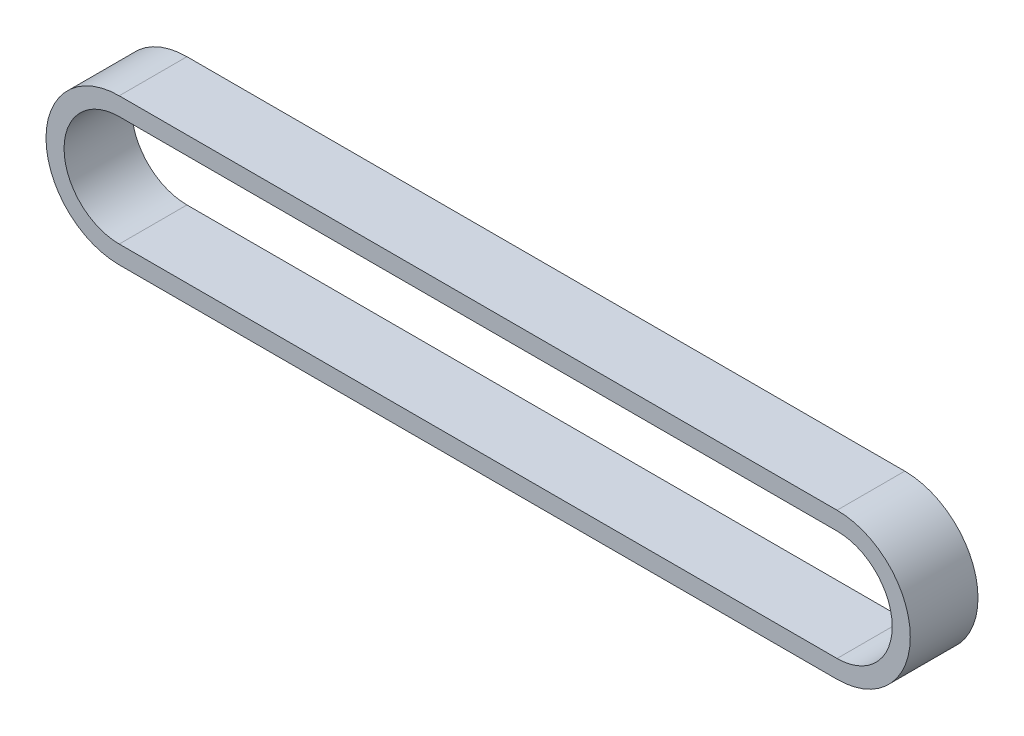
ISO-10303-21;
HEADER;
FILE_DESCRIPTION(('STEP AP214'),'2;1');
FILE_NAME('part.step','',(''),(''),'','','');
FILE_SCHEMA(('AUTOMOTIVE_DESIGN { 1 0 10303 214 1 1 1 1 }'));
ENDSEC;
DATA;
#1=APPLICATION_CONTEXT('core data for automotive mechanical design processes');
#2=APPLICATION_PROTOCOL_DEFINITION('international standard','automotive_design',2000,#1);
#3=PRODUCT_CONTEXT('',#1,'mechanical');
#4=PRODUCT('Part','Part','',(#3));
#5=PRODUCT_RELATED_PRODUCT_CATEGORY('part','',(#4));
#6=PRODUCT_DEFINITION_FORMATION('','',#4);
#7=PRODUCT_DEFINITION_CONTEXT('part definition',#1,'design');
#8=PRODUCT_DEFINITION('design','',#6,#7);
#9=PRODUCT_DEFINITION_SHAPE('','',#8);
#10=(LENGTH_UNIT() NAMED_UNIT(*) SI_UNIT(.MILLI.,.METRE.));
#11=(NAMED_UNIT(*) PLANE_ANGLE_UNIT() SI_UNIT($,.RADIAN.));
#12=(NAMED_UNIT(*) SI_UNIT($,.STERADIAN.) SOLID_ANGLE_UNIT());
#13=UNCERTAINTY_MEASURE_WITH_UNIT(LENGTH_MEASURE(1.E-05),#10,'distance_accuracy_value','');
#14=(GEOMETRIC_REPRESENTATION_CONTEXT(3) GLOBAL_UNCERTAINTY_ASSIGNED_CONTEXT((#13)) GLOBAL_UNIT_ASSIGNED_CONTEXT((#10,
#11,#12)) REPRESENTATION_CONTEXT('',''));
#15=CARTESIAN_POINT('',(0.,0.,0.));
#16=DIRECTION('',(0.,0.,1.));
#17=DIRECTION('',(1.,0.,0.));
#18=AXIS2_PLACEMENT_3D('',#15,#16,#17);
#19=CARTESIAN_POINT('',(-39.75,0.,7.5));
#20=DIRECTION('',(0.,0.,1.));
#21=DIRECTION('',(1.,0.,0.));
#22=AXIS2_PLACEMENT_3D('',#19,#20,#21);
#23=PLANE('',#22);
#24=CARTESIAN_POINT('',(-39.75,0.,7.5));
#25=DIRECTION('',(0.,0.,1.));
#26=DIRECTION('',(1.,0.,0.));
#27=AXIS2_PLACEMENT_3D('',#24,#25,#26);
#28=CIRCLE('',#27,8.11);
#29=CARTESIAN_POINT('',(-39.75,8.11,7.5));
#30=VERTEX_POINT('',#29);
#31=CARTESIAN_POINT('',(-39.75,-8.11,7.5));
#32=VERTEX_POINT('',#31);
#33=EDGE_CURVE('E153',#30,#32,#28,.T.);
#34=ORIENTED_EDGE('',*,*,#33,.T.);
#35=DIRECTION('',(1.,0.,0.));
#36=VECTOR('',#35,1.);
#37=CARTESIAN_POINT('',(-39.75,-8.11,7.5));
#38=LINE('',#37,#36);
#39=CARTESIAN_POINT('',(39.75,-8.10999999999999,7.5));
#40=VERTEX_POINT('',#39);
#41=EDGE_CURVE('E157',#32,#40,#38,.T.);
#42=ORIENTED_EDGE('',*,*,#41,.T.);
#43=CARTESIAN_POINT('',(39.75,0.,7.5));
#44=DIRECTION('',(0.,0.,1.));
#45=DIRECTION('',(-1.,0.,0.));
#46=AXIS2_PLACEMENT_3D('',#43,#44,#45);
#47=CIRCLE('',#46,8.11);
#48=CARTESIAN_POINT('',(39.75,8.11000000000001,7.5));
#49=VERTEX_POINT('',#48);
#50=EDGE_CURVE('E161',#40,#49,#47,.T.);
#51=ORIENTED_EDGE('',*,*,#50,.T.);
#52=DIRECTION('',(-1.,0.,0.));
#53=VECTOR('',#52,1.);
#54=CARTESIAN_POINT('',(-39.75,8.11,7.5));
#55=LINE('',#54,#53);
#56=EDGE_CURVE('E164',#49,#30,#55,.T.);
#57=ORIENTED_EDGE('',*,*,#56,.T.);
#58=EDGE_LOOP('',(#34,#42,#51,#57));
#59=FACE_BOUND('',#58,.T.);
#60=DIRECTION('',(1.,0.,0.));
#61=VECTOR('',#60,1.);
#62=CARTESIAN_POINT('',(-39.75,-6.11,7.5));
#63=LINE('',#62,#61);
#64=CARTESIAN_POINT('',(-39.75,-6.11,7.5));
#65=VERTEX_POINT('',#64);
#66=CARTESIAN_POINT('',(39.75,-6.10999999999999,7.5));
#67=VERTEX_POINT('',#66);
#68=EDGE_CURVE('E114',#65,#67,#63,.T.);
#69=ORIENTED_EDGE('',*,*,#68,.F.);
#70=CARTESIAN_POINT('',(-39.75,0.,7.5));
#71=DIRECTION('',(0.,0.,1.));
#72=DIRECTION('',(1.,0.,0.));
#73=AXIS2_PLACEMENT_3D('',#70,#71,#72);
#74=CIRCLE('',#73,6.11);
#75=CARTESIAN_POINT('',(-39.75,6.11,7.5));
#76=VERTEX_POINT('',#75);
#77=EDGE_CURVE('E105',#76,#65,#74,.T.);
#78=ORIENTED_EDGE('',*,*,#77,.F.);
#79=DIRECTION('',(-1.,0.,0.));
#80=VECTOR('',#79,1.);
#81=CARTESIAN_POINT('',(-39.75,6.11,7.5));
#82=LINE('',#81,#80);
#83=CARTESIAN_POINT('',(39.75,6.11000000000001,7.5));
#84=VERTEX_POINT('',#83);
#85=EDGE_CURVE('E131',#84,#76,#82,.T.);
#86=ORIENTED_EDGE('',*,*,#85,.F.);
#87=CARTESIAN_POINT('',(39.75,0.,7.5));
#88=DIRECTION('',(0.,0.,1.));
#89=DIRECTION('',(-1.,0.,0.));
#90=AXIS2_PLACEMENT_3D('',#87,#88,#89);
#91=CIRCLE('',#90,6.11);
#92=EDGE_CURVE('E127',#67,#84,#91,.T.);
#93=ORIENTED_EDGE('',*,*,#92,.F.);
#94=EDGE_LOOP('',(#69,#78,#86,#93));
#95=FACE_BOUND('',#94,.T.);
#96=ADVANCED_FACE('F39',(#59,#95),#23,.T.);
#97=CARTESIAN_POINT('',(-39.75,0.,0.));
#98=DIRECTION('',(0.,0.,1.));
#99=DIRECTION('',(1.,0.,0.));
#100=AXIS2_PLACEMENT_3D('',#97,#98,#99);
#101=PLANE('',#100);
#102=CARTESIAN_POINT('',(-39.75,0.,0.));
#103=DIRECTION('',(0.,0.,1.));
#104=DIRECTION('',(1.,0.,0.));
#105=AXIS2_PLACEMENT_3D('',#102,#103,#104);
#106=CIRCLE('',#105,8.11);
#107=CARTESIAN_POINT('',(-39.75,8.11,0.));
#108=VERTEX_POINT('',#107);
#109=CARTESIAN_POINT('',(-39.75,-8.11,0.));
#110=VERTEX_POINT('',#109);
#111=EDGE_CURVE('E123',#108,#110,#106,.T.);
#112=ORIENTED_EDGE('',*,*,#111,.F.);
#113=DIRECTION('',(-1.,0.,0.));
#114=VECTOR('',#113,1.);
#115=CARTESIAN_POINT('',(-39.75,8.11,0.));
#116=LINE('',#115,#114);
#117=CARTESIAN_POINT('',(39.75,8.11000000000001,0.));
#118=VERTEX_POINT('',#117);
#119=EDGE_CURVE('E158',#118,#108,#116,.T.);
#120=ORIENTED_EDGE('',*,*,#119,.F.);
#121=CARTESIAN_POINT('',(39.75,0.,0.));
#122=DIRECTION('',(0.,0.,1.));
#123=DIRECTION('',(-1.,0.,0.));
#124=AXIS2_PLACEMENT_3D('',#121,#122,#123);
#125=CIRCLE('',#124,8.11);
#126=CARTESIAN_POINT('',(39.75,-8.10999999999999,0.));
#127=VERTEX_POINT('',#126);
#128=EDGE_CURVE('E174',#127,#118,#125,.T.);
#129=ORIENTED_EDGE('',*,*,#128,.F.);
#130=DIRECTION('',(1.,0.,0.));
#131=VECTOR('',#130,1.);
#132=CARTESIAN_POINT('',(-39.75,-8.11,0.));
#133=LINE('',#132,#131);
#134=EDGE_CURVE('E171',#110,#127,#133,.T.);
#135=ORIENTED_EDGE('',*,*,#134,.F.);
#136=EDGE_LOOP('',(#112,#120,#129,#135));
#137=FACE_BOUND('',#136,.T.);
#138=CARTESIAN_POINT('',(-39.75,0.,0.));
#139=DIRECTION('',(0.,0.,1.));
#140=DIRECTION('',(1.,0.,0.));
#141=AXIS2_PLACEMENT_3D('',#138,#139,#140);
#142=CIRCLE('',#141,6.11);
#143=CARTESIAN_POINT('',(-39.75,6.11,0.));
#144=VERTEX_POINT('',#143);
#145=CARTESIAN_POINT('',(-39.75,-6.11,0.));
#146=VERTEX_POINT('',#145);
#147=EDGE_CURVE('E63',#144,#146,#142,.T.);
#148=ORIENTED_EDGE('',*,*,#147,.T.);
#149=DIRECTION('',(1.,0.,0.));
#150=VECTOR('',#149,1.);
#151=CARTESIAN_POINT('',(-39.75,-6.11,0.));
#152=LINE('',#151,#150);
#153=CARTESIAN_POINT('',(39.75,-6.10999999999999,0.));
#154=VERTEX_POINT('',#153);
#155=EDGE_CURVE('E121',#146,#154,#152,.T.);
#156=ORIENTED_EDGE('',*,*,#155,.T.);
#157=CARTESIAN_POINT('',(39.75,0.,0.));
#158=DIRECTION('',(0.,0.,1.));
#159=DIRECTION('',(-1.,0.,0.));
#160=AXIS2_PLACEMENT_3D('',#157,#158,#159);
#161=CIRCLE('',#160,6.11);
#162=CARTESIAN_POINT('',(39.75,6.11000000000001,0.));
#163=VERTEX_POINT('',#162);
#164=EDGE_CURVE('E140',#154,#163,#161,.T.);
#165=ORIENTED_EDGE('',*,*,#164,.T.);
#166=DIRECTION('',(-1.,0.,0.));
#167=VECTOR('',#166,1.);
#168=CARTESIAN_POINT('',(-39.75,6.11,0.));
#169=LINE('',#168,#167);
#170=EDGE_CURVE('E115',#163,#144,#169,.T.);
#171=ORIENTED_EDGE('',*,*,#170,.T.);
#172=EDGE_LOOP('',(#148,#156,#165,#171));
#173=FACE_BOUND('',#172,.T.);
#174=ADVANCED_FACE('F197',(#137,#173),#101,.F.);
#175=CARTESIAN_POINT('',(-39.75,0.,7.5));
#176=DIRECTION('',(0.,0.,-1.));
#177=DIRECTION('',(-1.,0.,0.));
#178=AXIS2_PLACEMENT_3D('',#175,#176,#177);
#179=CYLINDRICAL_SURFACE('',#178,8.11);
#180=ORIENTED_EDGE('',*,*,#111,.T.);
#181=DIRECTION('',(0.,0.,-1.));
#182=VECTOR('',#181,1.);
#183=CARTESIAN_POINT('',(-39.75,-8.11,7.5));
#184=LINE('',#183,#182);
#185=EDGE_CURVE('E11',#32,#110,#184,.T.);
#186=ORIENTED_EDGE('',*,*,#185,.F.);
#187=ORIENTED_EDGE('',*,*,#33,.F.);
#188=DIRECTION('',(0.,0.,-1.));
#189=VECTOR('',#188,1.);
#190=CARTESIAN_POINT('',(-39.75,8.11,7.5));
#191=LINE('',#190,#189);
#192=EDGE_CURVE('E167',#30,#108,#191,.T.);
#193=ORIENTED_EDGE('',*,*,#192,.T.);
#194=EDGE_LOOP('',(#180,#186,#187,#193));
#195=FACE_BOUND('',#194,.T.);
#196=ADVANCED_FACE('F41',(#195),#179,.T.);
#197=CARTESIAN_POINT('',(-39.75,-8.11,7.5));
#198=DIRECTION('',(0.,1.,0.));
#199=DIRECTION('',(-1.,0.,0.));
#200=AXIS2_PLACEMENT_3D('',#197,#198,#199);
#201=PLANE('',#200);
#202=ORIENTED_EDGE('',*,*,#134,.T.);
#203=DIRECTION('',(0.,0.,-1.));
#204=VECTOR('',#203,1.);
#205=CARTESIAN_POINT('',(39.75,-8.10999999999999,7.5));
#206=LINE('',#205,#204);
#207=EDGE_CURVE('E48',#40,#127,#206,.T.);
#208=ORIENTED_EDGE('',*,*,#207,.F.);
#209=ORIENTED_EDGE('',*,*,#41,.F.);
#210=ORIENTED_EDGE('',*,*,#185,.T.);
#211=EDGE_LOOP('',(#202,#208,#209,#210));
#212=FACE_BOUND('',#211,.T.);
#213=ADVANCED_FACE('F207',(#212),#201,.F.);
#214=CARTESIAN_POINT('',(39.75,0.,7.5));
#215=DIRECTION('',(0.,0.,-1.));
#216=DIRECTION('',(-1.,0.,0.));
#217=AXIS2_PLACEMENT_3D('',#214,#215,#216);
#218=CYLINDRICAL_SURFACE('',#217,8.11);
#219=ORIENTED_EDGE('',*,*,#128,.T.);
#220=DIRECTION('',(0.,0.,-1.));
#221=VECTOR('',#220,1.);
#222=CARTESIAN_POINT('',(39.75,8.11000000000001,7.5));
#223=LINE('',#222,#221);
#224=EDGE_CURVE('E182',#49,#118,#223,.T.);
#225=ORIENTED_EDGE('',*,*,#224,.F.);
#226=ORIENTED_EDGE('',*,*,#50,.F.);
#227=ORIENTED_EDGE('',*,*,#207,.T.);
#228=EDGE_LOOP('',(#219,#225,#226,#227));
#229=FACE_BOUND('',#228,.T.);
#230=ADVANCED_FACE('F191',(#229),#218,.T.);
#231=CARTESIAN_POINT('',(-39.75,8.11,7.5));
#232=DIRECTION('',(0.,-1.,0.));
#233=DIRECTION('',(1.,0.,0.));
#234=AXIS2_PLACEMENT_3D('',#231,#232,#233);
#235=PLANE('',#234);
#236=ORIENTED_EDGE('',*,*,#119,.T.);
#237=ORIENTED_EDGE('',*,*,#192,.F.);
#238=ORIENTED_EDGE('',*,*,#56,.F.);
#239=ORIENTED_EDGE('',*,*,#224,.T.);
#240=EDGE_LOOP('',(#236,#237,#238,#239));
#241=FACE_BOUND('',#240,.T.);
#242=ADVANCED_FACE('F201',(#241),#235,.F.);
#243=CARTESIAN_POINT('',(-39.75,0.,7.5));
#244=DIRECTION('',(0.,0.,-1.));
#245=DIRECTION('',(-1.,0.,0.));
#246=AXIS2_PLACEMENT_3D('',#243,#244,#245);
#247=CYLINDRICAL_SURFACE('',#246,6.11);
#248=ORIENTED_EDGE('',*,*,#147,.F.);
#249=DIRECTION('',(0.,0.,-1.));
#250=VECTOR('',#249,1.);
#251=CARTESIAN_POINT('',(-39.75,6.11,7.5));
#252=LINE('',#251,#250);
#253=EDGE_CURVE('E109',#76,#144,#252,.T.);
#254=ORIENTED_EDGE('',*,*,#253,.F.);
#255=ORIENTED_EDGE('',*,*,#77,.T.);
#256=DIRECTION('',(0.,0.,-1.));
#257=VECTOR('',#256,1.);
#258=CARTESIAN_POINT('',(-39.75,-6.11,7.5));
#259=LINE('',#258,#257);
#260=EDGE_CURVE('E108',#65,#146,#259,.T.);
#261=ORIENTED_EDGE('',*,*,#260,.T.);
#262=EDGE_LOOP('',(#248,#254,#255,#261));
#263=FACE_BOUND('',#262,.T.);
#264=ADVANCED_FACE('F107',(#263),#247,.F.);
#265=CARTESIAN_POINT('',(-39.75,-6.11,7.5));
#266=DIRECTION('',(0.,1.,0.));
#267=DIRECTION('',(-1.,0.,0.));
#268=AXIS2_PLACEMENT_3D('',#265,#266,#267);
#269=PLANE('',#268);
#270=ORIENTED_EDGE('',*,*,#155,.F.);
#271=ORIENTED_EDGE('',*,*,#260,.F.);
#272=ORIENTED_EDGE('',*,*,#68,.T.);
#273=DIRECTION('',(0.,0.,-1.));
#274=VECTOR('',#273,1.);
#275=CARTESIAN_POINT('',(39.75,-6.10999999999999,7.5));
#276=LINE('',#275,#274);
#277=EDGE_CURVE('E124',#67,#154,#276,.T.);
#278=ORIENTED_EDGE('',*,*,#277,.T.);
#279=EDGE_LOOP('',(#270,#271,#272,#278));
#280=FACE_BOUND('',#279,.T.);
#281=ADVANCED_FACE('F118',(#280),#269,.T.);
#282=CARTESIAN_POINT('',(39.75,0.,7.5));
#283=DIRECTION('',(0.,0.,-1.));
#284=DIRECTION('',(-1.,0.,0.));
#285=AXIS2_PLACEMENT_3D('',#282,#283,#284);
#286=CYLINDRICAL_SURFACE('',#285,6.11);
#287=ORIENTED_EDGE('',*,*,#164,.F.);
#288=ORIENTED_EDGE('',*,*,#277,.F.);
#289=ORIENTED_EDGE('',*,*,#92,.T.);
#290=DIRECTION('',(0.,0.,-1.));
#291=VECTOR('',#290,1.);
#292=CARTESIAN_POINT('',(39.75,6.11000000000001,7.5));
#293=LINE('',#292,#291);
#294=EDGE_CURVE('E55',#84,#163,#293,.T.);
#295=ORIENTED_EDGE('',*,*,#294,.T.);
#296=EDGE_LOOP('',(#287,#288,#289,#295));
#297=FACE_BOUND('',#296,.T.);
#298=ADVANCED_FACE('F230',(#297),#286,.F.);
#299=CARTESIAN_POINT('',(-39.75,6.11,7.5));
#300=DIRECTION('',(0.,-1.,0.));
#301=DIRECTION('',(1.,0.,0.));
#302=AXIS2_PLACEMENT_3D('',#299,#300,#301);
#303=PLANE('',#302);
#304=ORIENTED_EDGE('',*,*,#170,.F.);
#305=ORIENTED_EDGE('',*,*,#294,.F.);
#306=ORIENTED_EDGE('',*,*,#85,.T.);
#307=ORIENTED_EDGE('',*,*,#253,.T.);
#308=EDGE_LOOP('',(#304,#305,#306,#307));
#309=FACE_BOUND('',#308,.T.);
#310=ADVANCED_FACE('F234',(#309),#303,.T.);
#311=CLOSED_SHELL('',(#96,#174,#196,#213,#230,#242,#264,#281,#298,#310));
#312=MANIFOLD_SOLID_BREP('B2',#311);
#313=ADVANCED_BREP_SHAPE_REPRESENTATION('',(#18,#312),#14);
#314=SHAPE_DEFINITION_REPRESENTATION(#9,#313);
ENDSEC;
END-ISO-10303-21;
